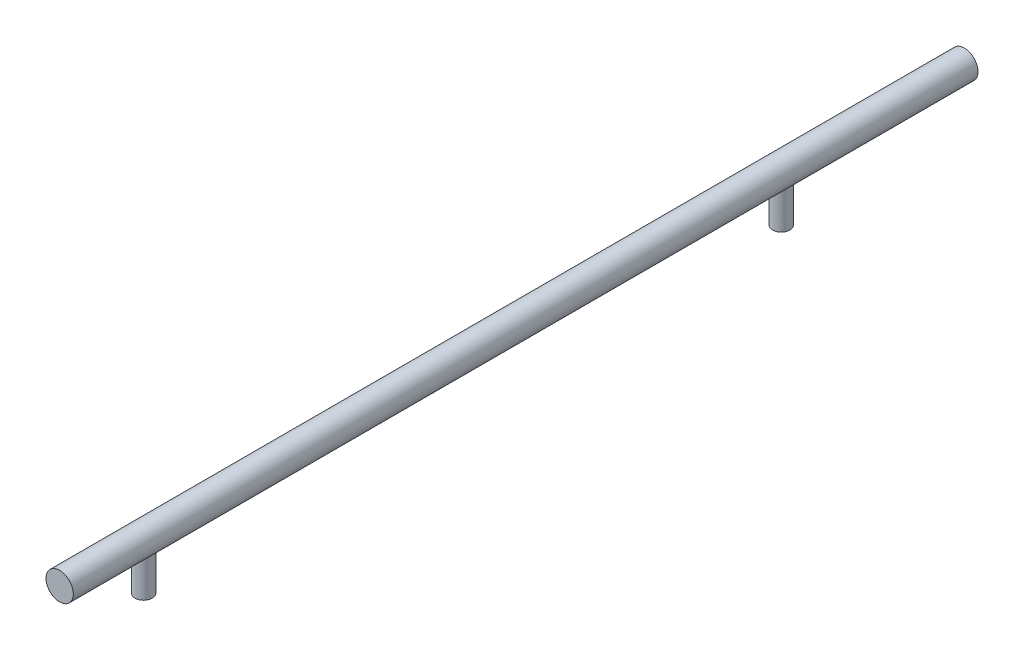
ISO-10303-21;
HEADER;
FILE_DESCRIPTION(('STEP AP214'),'2;1');
FILE_NAME('part.step','',(''),(''),'','','');
FILE_SCHEMA(('AUTOMOTIVE_DESIGN { 1 0 10303 214 1 1 1 1 }'));
ENDSEC;
DATA;
#1=APPLICATION_CONTEXT('core data for automotive mechanical design processes');
#2=APPLICATION_PROTOCOL_DEFINITION('international standard','automotive_design',2000,#1);
#3=PRODUCT_CONTEXT('',#1,'mechanical');
#4=PRODUCT('Part','Part','',(#3));
#5=PRODUCT_RELATED_PRODUCT_CATEGORY('part','',(#4));
#6=PRODUCT_DEFINITION_FORMATION('','',#4);
#7=PRODUCT_DEFINITION_CONTEXT('part definition',#1,'design');
#8=PRODUCT_DEFINITION('design','',#6,#7);
#9=PRODUCT_DEFINITION_SHAPE('','',#8);
#10=(LENGTH_UNIT() NAMED_UNIT(*) SI_UNIT(.MILLI.,.METRE.));
#11=(NAMED_UNIT(*) PLANE_ANGLE_UNIT() SI_UNIT($,.RADIAN.));
#12=(NAMED_UNIT(*) SI_UNIT($,.STERADIAN.) SOLID_ANGLE_UNIT());
#13=UNCERTAINTY_MEASURE_WITH_UNIT(LENGTH_MEASURE(1.E-05),#10,'distance_accuracy_value','');
#14=(GEOMETRIC_REPRESENTATION_CONTEXT(3) GLOBAL_UNCERTAINTY_ASSIGNED_CONTEXT((#13)) GLOBAL_UNIT_ASSIGNED_CONTEXT((#10,
#11,#12)) REPRESENTATION_CONTEXT('',''));
#15=CARTESIAN_POINT('',(0.,0.,0.));
#16=DIRECTION('',(0.,0.,1.));
#17=DIRECTION('',(1.,0.,0.));
#18=AXIS2_PLACEMENT_3D('',#15,#16,#17);
#19=CARTESIAN_POINT('',(0.,0.,210.));
#20=DIRECTION('',(0.,0.,-1.));
#21=DIRECTION('',(-1.,0.,0.));
#22=AXIS2_PLACEMENT_3D('',#19,#20,#21);
#23=CYLINDRICAL_SURFACE('',#22,3.175);
#24=CARTESIAN_POINT('',(0.,0.,210.));
#25=DIRECTION('',(0.,0.,1.));
#26=DIRECTION('',(1.,0.,0.));
#27=AXIS2_PLACEMENT_3D('',#24,#25,#26);
#28=CIRCLE('',#27,3.175);
#29=CARTESIAN_POINT('',(3.175,0.,210.));
#30=VERTEX_POINT('',#29);
#31=EDGE_CURVE('E53',#30,#30,#28,.T.);
#32=ORIENTED_EDGE('',*,*,#31,.F.);
#33=EDGE_LOOP('',(#32));
#34=FACE_BOUND('',#33,.T.);
#35=CARTESIAN_POINT('',(0.,0.,0.));
#36=DIRECTION('',(0.,0.,1.));
#37=DIRECTION('',(1.,0.,0.));
#38=AXIS2_PLACEMENT_3D('',#35,#36,#37);
#39=CIRCLE('',#38,3.175);
#40=CARTESIAN_POINT('',(3.175,0.,0.));
#41=VERTEX_POINT('',#40);
#42=EDGE_CURVE('E59',#41,#41,#39,.T.);
#43=ORIENTED_EDGE('',*,*,#42,.T.);
#44=EDGE_LOOP('',(#43));
#45=FACE_BOUND('',#44,.T.);
#46=CARTESIAN_POINT('',(0.,-3.175,188.5));
#47=CARTESIAN_POINT('',(0.101476525037058,-3.17499226289299,188.500008426132));
#48=CARTESIAN_POINT('',(0.203070052510219,-3.17008417823695,188.507775670624));
#49=CARTESIAN_POINT('',(0.403126766571678,-3.15091460168315,188.538425453796));
#50=CARTESIAN_POINT('',(0.501584012256516,-3.13663635064563,188.56133507611));
#51=CARTESIAN_POINT('',(0.692090634849499,-3.10016098732322,188.620924615736));
#52=CARTESIAN_POINT('',(0.784169067111652,-3.07800305101176,188.657536455171));
#53=CARTESIAN_POINT('',(0.960549971137726,-3.02760547522689,188.743025328171));
#54=CARTESIAN_POINT('',(1.04485310574214,-2.99936635485732,188.791901314898));
#55=CARTESIAN_POINT('',(1.2109639704167,-2.93644329633053,188.904865370727));
#56=CARTESIAN_POINT('',(1.29202459435627,-2.90142355627336,188.969861247594));
#57=CARTESIAN_POINT('',(1.44281789047478,-2.82946962284188,189.11112579896));
#58=CARTESIAN_POINT('',(1.51253493436165,-2.79253287918862,189.187409753755));
#59=CARTESIAN_POINT('',(1.64846069913403,-2.71479906783722,189.361404323038));
#60=CARTESIAN_POINT('',(1.71285716373583,-2.67417281468809,189.460619071715));
#61=CARTESIAN_POINT('',(1.82388334104333,-2.59972200280474,189.670834226668));
#62=CARTESIAN_POINT('',(1.87054322812345,-2.56588593898158,189.781814202118));
#63=CARTESIAN_POINT('',(1.93404005976774,-2.51818564470657,189.982806058619));
#64=CARTESIAN_POINT('',(1.95549189401937,-2.50140969328061,190.070664135488));
#65=CARTESIAN_POINT('',(1.98634051931269,-2.47698936531946,190.249661461112));
#66=CARTESIAN_POINT('',(1.99575475877688,-2.46933177288692,190.340795763404));
#67=CARTESIAN_POINT('',(2.00196100490322,-2.46430468488944,190.524042381473));
#68=CARTESIAN_POINT('',(1.99871804869056,-2.46696368665383,190.616156704357));
#69=CARTESIAN_POINT('',(1.97975435108006,-2.48220365208432,190.798279520497));
#70=CARTESIAN_POINT('',(1.96402350468153,-2.49479265089232,190.888286247572));
#71=CARTESIAN_POINT('',(1.92154408819562,-2.52764357716515,191.061644773727));
#72=CARTESIAN_POINT('',(1.89508126789266,-2.54770547926273,191.145106778337));
#73=CARTESIAN_POINT('',(1.83220192270644,-2.59329248142859,191.306568124763));
#74=CARTESIAN_POINT('',(1.7957818968114,-2.61881950237854,191.384565533054));
#75=CARTESIAN_POINT('',(1.70611370468257,-2.67828449369145,191.548563642775));
#76=CARTESIAN_POINT('',(1.65098588782387,-2.71290024559201,191.633290176462));
#77=CARTESIAN_POINT('',(1.52895400605438,-2.78350606267572,191.793226317701));
#78=CARTESIAN_POINT('',(1.46203770576498,-2.8194975250315,191.868425896355));
#79=CARTESIAN_POINT('',(1.3048766520094,-2.89599631992293,192.020254943097));
#80=CARTESIAN_POINT('',(1.21259971177505,-2.93622794327932,192.094944059044));
#81=CARTESIAN_POINT('',(1.01448876791332,-3.01041623037065,192.227717061236));
#82=CARTESIAN_POINT('',(0.908659634525409,-3.04437513767011,192.285806888637));
#83=CARTESIAN_POINT('',(0.691622427030102,-3.1006744181714,192.380136141542));
#84=CARTESIAN_POINT('',(0.580977452615198,-3.12352576206067,192.417352038568));
#85=CARTESIAN_POINT('',(0.353219543278313,-3.15737991805264,192.472027875895));
#86=CARTESIAN_POINT('',(0.236116326382344,-3.16840004787419,192.489516693248));
#87=CARTESIAN_POINT('',(0.0180413733491877,-3.1765355644463,192.502439295483));
#88=CARTESIAN_POINT('',(-0.0826993681605599,-3.17549752338765,192.500801814326));
#89=CARTESIAN_POINT('',(-0.282251535700962,-3.16400646666093,192.482514748441));
#90=CARTESIAN_POINT('',(-0.38106311497857,-3.15355420196555,192.465866361134));
#91=CARTESIAN_POINT('',(-0.569785789390983,-3.12485337509414,192.419478249003));
#92=CARTESIAN_POINT('',(-0.659896585711481,-3.10695351243135,192.390322434004));
#93=CARTESIAN_POINT('',(-0.833839239568707,-3.06485767127365,192.320304640589));
#94=CARTESIAN_POINT('',(-0.917670073048528,-3.04066066878657,192.279440758187));
#95=CARTESIAN_POINT('',(-1.08579010212587,-2.98501096062797,192.182673277414));
#96=CARTESIAN_POINT('',(-1.16928557007131,-2.95307446884992,192.125673818041));
#97=CARTESIAN_POINT('',(-1.32610017982497,-2.88606502180743,192.000513954747));
#98=CARTESIAN_POINT('',(-1.39940803331593,-2.85098865705074,191.932341349864));
#99=CARTESIAN_POINT('',(-1.5450195333334,-2.77510866590551,191.77516042561));
#100=CARTESIAN_POINT('',(-1.61557264573246,-2.73422493399918,191.684561785819));
#101=CARTESIAN_POINT('',(-1.74075576106749,-2.65628150074483,191.49145743449));
#102=CARTESIAN_POINT('',(-1.79539548284395,-2.61921947432595,191.388959044258));
#103=CARTESIAN_POINT('',(-1.87731719418663,-2.56091666468433,191.195898262808));
#104=CARTESIAN_POINT('',(-1.90792193981147,-2.5379888591193,191.107263291976));
#105=CARTESIAN_POINT('',(-1.95660261704509,-2.50065678385652,190.924943097226));
#106=CARTESIAN_POINT('',(-1.97469844769937,-2.48623898190295,190.831266151138));
#107=CARTESIAN_POINT('',(-1.99736898375345,-2.46807030692743,190.640624203534));
#108=CARTESIAN_POINT('',(-2.00186040231689,-2.46438514488327,190.54364260959));
#109=CARTESIAN_POINT('',(-1.99673295842469,-2.46854006574368,190.350286015143));
#110=CARTESIAN_POINT('',(-1.98711028907932,-2.47638325810819,190.253911185339));
#111=CARTESIAN_POINT('',(-1.95590161091486,-2.50108241635967,190.073241564104));
#112=CARTESIAN_POINT('',(-1.9354349287763,-2.51709058194002,189.988627240323));
#113=CARTESIAN_POINT('',(-1.88430589785024,-2.5555891861702,189.824115405762));
#114=CARTESIAN_POINT('',(-1.85363913716579,-2.57808242928517,189.744219953704));
#115=CARTESIAN_POINT('',(-1.77802954743067,-2.63090189354455,189.57913797878));
#116=CARTESIAN_POINT('',(-1.73167768941998,-2.66188689358513,189.494811735499));
#117=CARTESIAN_POINT('',(-1.62798716761767,-2.72654071214851,189.334323904601));
#118=CARTESIAN_POINT('',(-1.57063976998899,-2.76021165163326,189.258168882949));
#119=CARTESIAN_POINT('',(-1.43290771955616,-2.83455450899613,189.100036483282));
#120=CARTESIAN_POINT('',(-1.35021039869715,-2.87524740651978,189.020062948595));
#121=CARTESIAN_POINT('',(-1.17116070071828,-2.95271860295749,188.874669301771));
#122=CARTESIAN_POINT('',(-1.07479913792044,-2.98949423916135,188.809259056338));
#123=CARTESIAN_POINT('',(-0.869021324089841,-3.05567422341637,188.694805871433));
#124=CARTESIAN_POINT('',(-0.759495717250612,-3.08500948592017,188.645915022968));
#125=CARTESIAN_POINT('',(-0.588629915706906,-3.12050401388052,188.587633316419));
#126=CARTESIAN_POINT('',(-0.530633997223184,-3.13091186629432,188.570723710641));
#127=CARTESIAN_POINT('',(-0.412912445199558,-3.14859608649339,188.542153944402));
#128=CARTESIAN_POINT('',(-0.353188086098318,-3.15587470179684,188.530490016048));
#129=CARTESIAN_POINT('',(-0.244573633037745,-3.16593862131482,188.514408722852));
#130=CARTESIAN_POINT('',(-0.19588156893454,-3.1693284738155,188.509013446489));
#131=CARTESIAN_POINT('',(-0.0981354745407029,-3.17386110076005,188.501806941271));
#132=CARTESIAN_POINT('',(-0.0490814230021927,-3.1750037422273,188.49999592451));
#133=CARTESIAN_POINT('',(0.,-3.175,188.5));
#134=B_SPLINE_CURVE_WITH_KNOTS('',3,(#46,#47,#48,#49,#50,#51,#52,#53,#54,#55,#56,#57,#58,#59,
#60,#61,#62,#63,#64,#65,#66,#67,#68,#69,#70,#71,#72,#73,#74,#75,#76,#77,#78,#79,#80,#81,#82,#83,
#84,#85,#86,#87,#88,#89,#90,#91,#92,#93,#94,#95,#96,#97,#98,#99,#100,#101,#102,#103,#104,#105,
#106,#107,#108,#109,#110,#111,#112,#113,#114,#115,#116,#117,#118,#119,#120,#121,#122,#123,#124,
#125,#126,#127,#128,#129,#130,#131,#132,#133),.UNSPECIFIED.,.T.,.F.,(4,2,2,2,2,2,2,2,2,2,2,2,2,
2,2,2,2,2,2,2,2,2,2,2,2,2,2,2,2,2,2,2,2,2,2,2,2,2,2,2,2,2,2,4),(0.,0.304232392052236,
0.609010411584715,0.912293856546597,1.21555142279238,1.54321972601859,1.87133571080326,
2.24473770562467,2.61750157607974,2.89230792913175,3.16671549876434,3.44188159806796,
3.71727058461243,3.98576376754472,4.25435147593011,4.57371032212578,4.89340260802562,
5.267577042325,5.64161738528109,5.99627086908169,6.35040452472408,6.65112338712868,
6.95181826331199,7.23978633358549,7.52780126029116,7.84463984501204,8.16182674815679,
8.52590386283171,8.88975815489272,9.17822046878512,9.46622283736115,9.75598484184773,
10.0458250160945,10.310328368308,10.5749462767354,10.8771490479437,11.1795928629566,
11.5440020655339,11.9086574109828,12.2765839914834,12.4602144397248,12.6437127774711,
12.7908529677973,12.9380018647449),.UNSPECIFIED.);
#135=CARTESIAN_POINT('',(0.,-3.175,188.5));
#136=VERTEX_POINT('',#135);
#137=EDGE_CURVE('E49',#136,#136,#134,.T.);
#138=ORIENTED_EDGE('',*,*,#137,.F.);
#139=EDGE_LOOP('',(#138));
#140=FACE_BOUND('',#139,.T.);
#141=CARTESIAN_POINT('',(0.,-3.175,40.5));
#142=CARTESIAN_POINT('',(0.101476525037058,-3.17499226289299,40.5000084261316));
#143=CARTESIAN_POINT('',(0.203070052510219,-3.17008417823695,40.5077756706241));
#144=CARTESIAN_POINT('',(0.403126766571679,-3.15091460168315,40.5384254537958));
#145=CARTESIAN_POINT('',(0.501584012256518,-3.13663635064563,40.5613350761103));
#146=CARTESIAN_POINT('',(0.692090634849497,-3.10016098732322,40.6209246157355));
#147=CARTESIAN_POINT('',(0.784169067111647,-3.07800305101176,40.6575364551709));
#148=CARTESIAN_POINT('',(0.960549971137719,-3.02760547522689,40.7430253281709));
#149=CARTESIAN_POINT('',(1.04485310574213,-2.99936635485732,40.7919013148984));
#150=CARTESIAN_POINT('',(1.2109639704167,-2.93644329633053,40.9048653707267));
#151=CARTESIAN_POINT('',(1.29202459435627,-2.90142355627336,40.9698612475937));
#152=CARTESIAN_POINT('',(1.44281789047478,-2.82946962284188,41.1111257989596));
#153=CARTESIAN_POINT('',(1.51253493436166,-2.79253287918862,41.1874097537548));
#154=CARTESIAN_POINT('',(1.64846069913404,-2.71479906783721,41.3614043230377));
#155=CARTESIAN_POINT('',(1.71285716373584,-2.67417281468809,41.4606190717147));
#156=CARTESIAN_POINT('',(1.82388334104334,-2.59972200280474,41.6708342266676));
#157=CARTESIAN_POINT('',(1.87054322812345,-2.56588593898158,41.7818142021178));
#158=CARTESIAN_POINT('',(1.93404005976775,-2.51818564470656,41.9828060586186));
#159=CARTESIAN_POINT('',(1.95549189401938,-2.50140969328061,42.0706641354879));
#160=CARTESIAN_POINT('',(1.9863405193127,-2.47698936531946,42.2496614611124));
#161=CARTESIAN_POINT('',(1.99575475877688,-2.46933177288691,42.3407957634037));
#162=CARTESIAN_POINT('',(2.00196100490322,-2.46430468488944,42.5240423814727));
#163=CARTESIAN_POINT('',(1.99871804869056,-2.46696368665383,42.6161567043573));
#164=CARTESIAN_POINT('',(1.97975435108006,-2.48220365208432,42.798279520497));
#165=CARTESIAN_POINT('',(1.96402350468154,-2.49479265089232,42.8882862475716));
#166=CARTESIAN_POINT('',(1.92154408819563,-2.52764357716514,43.0616447737269));
#167=CARTESIAN_POINT('',(1.89508126789267,-2.54770547926273,43.145106778337));
#168=CARTESIAN_POINT('',(1.83220192270645,-2.59329248142859,43.3065681247628));
#169=CARTESIAN_POINT('',(1.79578189681142,-2.61881950237853,43.3845655330541));
#170=CARTESIAN_POINT('',(1.70611370468259,-2.67828449369144,43.5485636427753));
#171=CARTESIAN_POINT('',(1.65098588782389,-2.712900245592,43.6332901764615));
#172=CARTESIAN_POINT('',(1.52895400605439,-2.78350606267571,43.7932263177011));
#173=CARTESIAN_POINT('',(1.46203770576499,-2.81949752503149,43.8684258963549));
#174=CARTESIAN_POINT('',(1.30487665200941,-2.89599631992292,44.0202549430969));
#175=CARTESIAN_POINT('',(1.21259971177506,-2.93622794327932,44.0949440590442));
#176=CARTESIAN_POINT('',(1.01448876791333,-3.01041623037065,44.2277170612364));
#177=CARTESIAN_POINT('',(0.908659634525412,-3.04437513767011,44.2858068886366));
#178=CARTESIAN_POINT('',(0.691622427030106,-3.1006744181714,44.3801361415419));
#179=CARTESIAN_POINT('',(0.580977452615206,-3.12352576206067,44.4173520385677));
#180=CARTESIAN_POINT('',(0.353219543278321,-3.15737991805264,44.4720278758952));
#181=CARTESIAN_POINT('',(0.236116326382347,-3.16840004787418,44.4895166932476));
#182=CARTESIAN_POINT('',(0.0180413733491898,-3.1765355644463,44.502439295483));
#183=CARTESIAN_POINT('',(-0.0826993681605549,-3.17549752338765,44.5008018143257));
#184=CARTESIAN_POINT('',(-0.282251535700955,-3.16400646666093,44.4825147484411));
#185=CARTESIAN_POINT('',(-0.381063114978563,-3.15355420196555,44.4658663611336));
#186=CARTESIAN_POINT('',(-0.569785789390976,-3.12485337509414,44.4194782490029));
#187=CARTESIAN_POINT('',(-0.659896585711475,-3.10695351243135,44.3903224340044));
#188=CARTESIAN_POINT('',(-0.833839239568703,-3.06485767127365,44.3203046405885));
#189=CARTESIAN_POINT('',(-0.917670073048524,-3.04066066878657,44.2794407581866));
#190=CARTESIAN_POINT('',(-1.08579010212587,-2.98501096062797,44.1826732774144));
#191=CARTESIAN_POINT('',(-1.16928557007131,-2.95307446884992,44.1256738180405));
#192=CARTESIAN_POINT('',(-1.32610017982497,-2.88606502180743,44.000513954747));
#193=CARTESIAN_POINT('',(-1.39940803331593,-2.85098865705074,43.9323413498637));
#194=CARTESIAN_POINT('',(-1.54501953333341,-2.77510866590551,43.7751604256102));
#195=CARTESIAN_POINT('',(-1.61557264573246,-2.73422493399918,43.6845617858188));
#196=CARTESIAN_POINT('',(-1.74075576106748,-2.65628150074483,43.4914574344898));
#197=CARTESIAN_POINT('',(-1.79539548284394,-2.61921947432595,43.3889590442583));
#198=CARTESIAN_POINT('',(-1.87731719418662,-2.56091666468433,43.1958982628077));
#199=CARTESIAN_POINT('',(-1.90792193981147,-2.5379888591193,43.1072632919761));
#200=CARTESIAN_POINT('',(-1.95660261704509,-2.50065678385652,42.9249430972255));
#201=CARTESIAN_POINT('',(-1.97469844769937,-2.48623898190295,42.8312661511383));
#202=CARTESIAN_POINT('',(-1.99736898375345,-2.46807030692743,42.6406242035336));
#203=CARTESIAN_POINT('',(-2.00186040231689,-2.46438514488327,42.5436426095905));
#204=CARTESIAN_POINT('',(-1.99673295842469,-2.46854006574368,42.3502860151433));
#205=CARTESIAN_POINT('',(-1.98711028907932,-2.47638325810819,42.2539111853395));
#206=CARTESIAN_POINT('',(-1.95590161091486,-2.50108241635967,42.0732415641042));
#207=CARTESIAN_POINT('',(-1.9354349287763,-2.51709058194002,41.9886272403227));
#208=CARTESIAN_POINT('',(-1.88430589785024,-2.5555891861702,41.8241154057625));
#209=CARTESIAN_POINT('',(-1.85363913716579,-2.57808242928518,41.7442199537036));
#210=CARTESIAN_POINT('',(-1.77802954743066,-2.63090189354455,41.5791379787804));
#211=CARTESIAN_POINT('',(-1.73167768941997,-2.66188689358513,41.4948117354986));
#212=CARTESIAN_POINT('',(-1.62798716761766,-2.72654071214851,41.3343239046009));
#213=CARTESIAN_POINT('',(-1.57063976998899,-2.76021165163326,41.2581688829487));
#214=CARTESIAN_POINT('',(-1.43290771955615,-2.83455450899614,41.1000364832824));
#215=CARTESIAN_POINT('',(-1.35021039869714,-2.87524740651978,41.0200629485948));
#216=CARTESIAN_POINT('',(-1.17116070071825,-2.9527186029575,40.874669301771));
#217=CARTESIAN_POINT('',(-1.07479913792041,-2.98949423916137,40.8092590563383));
#218=CARTESIAN_POINT('',(-0.869021324089805,-3.05567422341638,40.694805871433));
#219=CARTESIAN_POINT('',(-0.759495717250585,-3.08500948592018,40.6459150229675));
#220=CARTESIAN_POINT('',(-0.588629915706882,-3.12050401388052,40.5876333164189));
#221=CARTESIAN_POINT('',(-0.530633997223157,-3.13091186629432,40.5707237106412));
#222=CARTESIAN_POINT('',(-0.412912445199536,-3.14859608649339,40.5421539444017));
#223=CARTESIAN_POINT('',(-0.353188086098304,-3.15587470179684,40.5304900160482));
#224=CARTESIAN_POINT('',(-0.24457363303774,-3.16593862131482,40.5144087228522));
#225=CARTESIAN_POINT('',(-0.195881568934536,-3.1693284738155,40.5090134464891));
#226=CARTESIAN_POINT('',(-0.0981354745407005,-3.17386110076005,40.5018069412706));
#227=CARTESIAN_POINT('',(-0.0490814230021916,-3.1750037422273,40.4999959245103));
#228=CARTESIAN_POINT('',(0.,-3.175,40.5));
#229=B_SPLINE_CURVE_WITH_KNOTS('',3,(#141,#142,#143,#144,#145,#146,#147,#148,#149,#150,#151,
#152,#153,#154,#155,#156,#157,#158,#159,#160,#161,#162,#163,#164,#165,#166,#167,#168,#169,#170,
#171,#172,#173,#174,#175,#176,#177,#178,#179,#180,#181,#182,#183,#184,#185,#186,#187,#188,#189,
#190,#191,#192,#193,#194,#195,#196,#197,#198,#199,#200,#201,#202,#203,#204,#205,#206,#207,#208,
#209,#210,#211,#212,#213,#214,#215,#216,#217,#218,#219,#220,#221,#222,#223,#224,#225,#226,#227,
#228),.UNSPECIFIED.,.T.,.F.,(4,2,2,2,2,2,2,2,2,2,2,2,2,2,2,2,2,2,2,2,2,2,2,2,2,2,2,2,2,2,2,2,2,
2,2,2,2,2,2,2,2,2,2,4),(0.,0.304232392052238,0.609010411584713,0.912293856546585,
1.21555142279238,1.5432197260186,1.87133571080327,2.24473770562468,2.61750157607976,
2.89230792913177,3.16671549876435,3.44188159806796,3.71727058461241,3.98576376754471,
4.25435147593007,4.57371032212575,4.89340260802561,5.267577042325,5.64161738528109,
5.99627086908168,6.35040452472408,6.65112338712868,6.95181826331198,7.23978633358549,
7.52780126029116,7.84463984501205,8.16182674815678,8.52590386283171,8.88975815489272,
9.17822046878512,9.46622283736116,9.75598484184772,10.0458250160945,10.310328368308,
10.5749462767354,10.8771490479437,11.1795928629566,11.5440020655339,11.9086574109828,
12.2765839914835,12.4602144397249,12.6437127774711,12.7908529677973,12.9380018647449),.UNSPECIFIED.);
#230=CARTESIAN_POINT('',(0.,-3.175,40.5));
#231=VERTEX_POINT('',#230);
#232=EDGE_CURVE('E10',#231,#231,#229,.T.);
#233=ORIENTED_EDGE('',*,*,#232,.F.);
#234=EDGE_LOOP('',(#233));
#235=FACE_BOUND('',#234,.T.);
#236=ADVANCED_FACE('F39',(#34,#45,#140,#235),#23,.T.);
#237=CARTESIAN_POINT('',(0.,0.,210.));
#238=DIRECTION('',(0.,0.,1.));
#239=DIRECTION('',(1.,0.,0.));
#240=AXIS2_PLACEMENT_3D('',#237,#238,#239);
#241=PLANE('',#240);
#242=ORIENTED_EDGE('',*,*,#31,.T.);
#243=EDGE_LOOP('',(#242));
#244=FACE_BOUND('',#243,.T.);
#245=ADVANCED_FACE('F80',(#244),#241,.T.);
#246=CARTESIAN_POINT('',(0.,0.,0.));
#247=DIRECTION('',(0.,0.,1.));
#248=DIRECTION('',(1.,0.,0.));
#249=AXIS2_PLACEMENT_3D('',#246,#247,#248);
#250=PLANE('',#249);
#251=ORIENTED_EDGE('',*,*,#42,.F.);
#252=EDGE_LOOP('',(#251));
#253=FACE_BOUND('',#252,.T.);
#254=ADVANCED_FACE('F66',(#253),#250,.F.);
#255=CARTESIAN_POINT('',(0.,-2.,190.5));
#256=DIRECTION('',(0.,-1.,0.));
#257=DIRECTION('',(0.,0.,-1.));
#258=AXIS2_PLACEMENT_3D('',#255,#256,#257);
#259=CYLINDRICAL_SURFACE('',#258,2.);
#260=CARTESIAN_POINT('',(0.,-11.175,190.5));
#261=DIRECTION('',(0.,1.,0.));
#262=DIRECTION('',(0.,0.,1.));
#263=AXIS2_PLACEMENT_3D('',#260,#261,#262);
#264=CIRCLE('',#263,2.);
#265=CARTESIAN_POINT('',(0.,-11.175,192.5));
#266=VERTEX_POINT('',#265);
#267=EDGE_CURVE('E100',#266,#266,#264,.T.);
#268=ORIENTED_EDGE('',*,*,#267,.T.);
#269=EDGE_LOOP('',(#268));
#270=FACE_BOUND('',#269,.T.);
#271=ORIENTED_EDGE('',*,*,#137,.T.);
#272=EDGE_LOOP('',(#271));
#273=FACE_BOUND('',#272,.T.);
#274=ADVANCED_FACE('F62',(#270,#273),#259,.T.);
#275=CARTESIAN_POINT('',(0.,-11.175,190.5));
#276=DIRECTION('',(0.,1.,0.));
#277=DIRECTION('',(0.,0.,1.));
#278=AXIS2_PLACEMENT_3D('',#275,#276,#277);
#279=PLANE('',#278);
#280=ORIENTED_EDGE('',*,*,#267,.F.);
#281=EDGE_LOOP('',(#280));
#282=FACE_BOUND('',#281,.T.);
#283=ADVANCED_FACE('F69',(#282),#279,.F.);
#284=CARTESIAN_POINT('',(0.,-2.,42.5));
#285=DIRECTION('',(0.,-1.,0.));
#286=DIRECTION('',(0.,0.,-1.));
#287=AXIS2_PLACEMENT_3D('',#284,#285,#286);
#288=CYLINDRICAL_SURFACE('',#287,2.);
#289=CARTESIAN_POINT('',(0.,-11.175,42.5));
#290=DIRECTION('',(0.,1.,0.));
#291=DIRECTION('',(0.,0.,1.));
#292=AXIS2_PLACEMENT_3D('',#289,#290,#291);
#293=CIRCLE('',#292,2.);
#294=CARTESIAN_POINT('',(0.,-11.175,44.5));
#295=VERTEX_POINT('',#294);
#296=EDGE_CURVE('E92',#295,#295,#293,.T.);
#297=ORIENTED_EDGE('',*,*,#296,.T.);
#298=EDGE_LOOP('',(#297));
#299=FACE_BOUND('',#298,.T.);
#300=ORIENTED_EDGE('',*,*,#232,.T.);
#301=EDGE_LOOP('',(#300));
#302=FACE_BOUND('',#301,.T.);
#303=ADVANCED_FACE('F75',(#299,#302),#288,.T.);
#304=CARTESIAN_POINT('',(0.,-11.175,42.5));
#305=DIRECTION('',(0.,1.,0.));
#306=DIRECTION('',(0.,0.,1.));
#307=AXIS2_PLACEMENT_3D('',#304,#305,#306);
#308=PLANE('',#307);
#309=ORIENTED_EDGE('',*,*,#296,.F.);
#310=EDGE_LOOP('',(#309));
#311=FACE_BOUND('',#310,.T.);
#312=ADVANCED_FACE('F104',(#311),#308,.F.);
#313=CLOSED_SHELL('',(#236,#245,#254,#274,#283,#303,#312));
#314=MANIFOLD_SOLID_BREP('B2',#313);
#315=ADVANCED_BREP_SHAPE_REPRESENTATION('',(#18,#314),#14);
#316=SHAPE_DEFINITION_REPRESENTATION(#9,#315);
ENDSEC;
END-ISO-10303-21;
